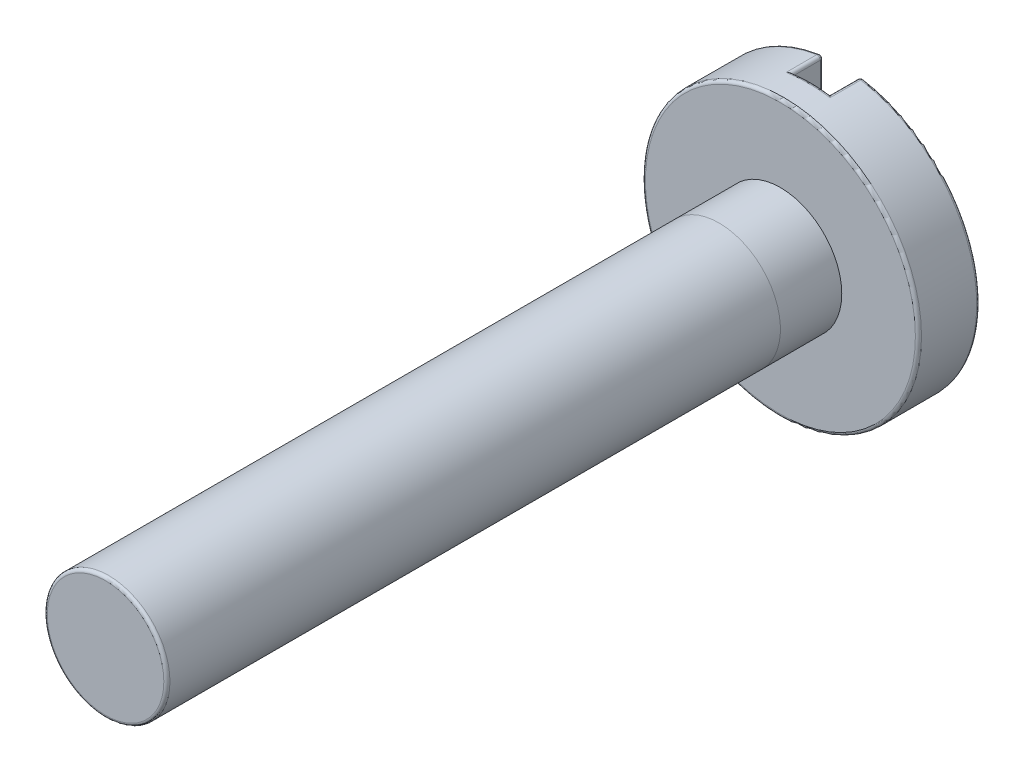
ISO-10303-21;
HEADER;
FILE_DESCRIPTION(('STEP AP214'),'2;1');
FILE_NAME('part.step','',(''),(''),'','','');
FILE_SCHEMA(('AUTOMOTIVE_DESIGN { 1 0 10303 214 1 1 1 1 }'));
ENDSEC;
DATA;
#1=APPLICATION_CONTEXT('core data for automotive mechanical design processes');
#2=APPLICATION_PROTOCOL_DEFINITION('international standard','automotive_design',2000,#1);
#3=PRODUCT_CONTEXT('',#1,'mechanical');
#4=PRODUCT('Part','Part','',(#3));
#5=PRODUCT_RELATED_PRODUCT_CATEGORY('part','',(#4));
#6=PRODUCT_DEFINITION_FORMATION('','',#4);
#7=PRODUCT_DEFINITION_CONTEXT('part definition',#1,'design');
#8=PRODUCT_DEFINITION('design','',#6,#7);
#9=PRODUCT_DEFINITION_SHAPE('','',#8);
#10=(LENGTH_UNIT() NAMED_UNIT(*) SI_UNIT(.MILLI.,.METRE.));
#11=(NAMED_UNIT(*) PLANE_ANGLE_UNIT() SI_UNIT($,.RADIAN.));
#12=(NAMED_UNIT(*) SI_UNIT($,.STERADIAN.) SOLID_ANGLE_UNIT());
#13=UNCERTAINTY_MEASURE_WITH_UNIT(LENGTH_MEASURE(1.E-05),#10,'distance_accuracy_value','');
#14=(GEOMETRIC_REPRESENTATION_CONTEXT(3) GLOBAL_UNCERTAINTY_ASSIGNED_CONTEXT((#13)) GLOBAL_UNIT_ASSIGNED_CONTEXT((#10,
#11,#12)) REPRESENTATION_CONTEXT('',''));
#15=CARTESIAN_POINT('',(0.,0.,0.));
#16=DIRECTION('',(0.,0.,1.));
#17=DIRECTION('',(1.,0.,0.));
#18=AXIS2_PLACEMENT_3D('',#15,#16,#17);
#19=CARTESIAN_POINT('',(0.,0.,11.));
#20=DIRECTION('',(0.,0.,-1.));
#21=DIRECTION('',(-1.,0.,0.));
#22=AXIS2_PLACEMENT_3D('',#19,#20,#21);
#23=CYLINDRICAL_SURFACE('',#22,1.);
#24=CARTESIAN_POINT('',(0.,0.,10.95));
#25=DIRECTION('',(0.,0.,1.));
#26=DIRECTION('',(1.,0.,0.));
#27=AXIS2_PLACEMENT_3D('',#24,#25,#26);
#28=CIRCLE('',#27,1.);
#29=CARTESIAN_POINT('',(1.,0.,10.95));
#30=VERTEX_POINT('',#29);
#31=EDGE_CURVE('E175',#30,#30,#28,.F.);
#32=ORIENTED_EDGE('',*,*,#31,.T.);
#33=EDGE_LOOP('',(#32));
#34=FACE_BOUND('',#33,.T.);
#35=CARTESIAN_POINT('',(0.,0.,0.999999999999999));
#36=DIRECTION('',(0.,0.,-1.));
#37=DIRECTION('',(-1.,0.,0.));
#38=AXIS2_PLACEMENT_3D('',#35,#36,#37);
#39=CIRCLE('',#38,1.);
#40=CARTESIAN_POINT('',(-1.,0.,0.999999999999999));
#41=VERTEX_POINT('',#40);
#42=EDGE_CURVE('E11',#41,#41,#39,.T.);
#43=ORIENTED_EDGE('',*,*,#42,.F.);
#44=EDGE_LOOP('',(#43));
#45=FACE_BOUND('',#44,.T.);
#46=ADVANCED_FACE('F45',(#34,#45),#23,.T.);
#47=CARTESIAN_POINT('',(0.,0.,-1.));
#48=DIRECTION('',(0.,0.,1.));
#49=DIRECTION('',(1.,0.,0.));
#50=AXIS2_PLACEMENT_3D('',#47,#48,#49);
#51=PLANE('',#50);
#52=DIRECTION('',(0.,-1.,0.));
#53=VECTOR('',#52,1.);
#54=CARTESIAN_POINT('',(-0.35,0.,-1.));
#55=LINE('',#54,#53);
#56=CARTESIAN_POINT('',(-0.35,2.17198066289735,-1.));
#57=VERTEX_POINT('',#56);
#58=CARTESIAN_POINT('',(-0.35,-2.17198066289735,-1.));
#59=VERTEX_POINT('',#58);
#60=EDGE_CURVE('E212',#57,#59,#55,.T.);
#61=ORIENTED_EDGE('',*,*,#60,.T.);
#62=CARTESIAN_POINT('',(0.,0.,-1.));
#63=DIRECTION('',(0.,0.,1.));
#64=DIRECTION('',(1.,0.,0.));
#65=AXIS2_PLACEMENT_3D('',#62,#63,#64);
#66=CIRCLE('',#65,2.2);
#67=EDGE_CURVE('E214',#59,#57,#66,.F.);
#68=ORIENTED_EDGE('',*,*,#67,.T.);
#69=EDGE_LOOP('',(#61,#68));
#70=FACE_BOUND('',#69,.T.);
#71=ADVANCED_FACE('F311',(#70),#51,.F.);
#72=ORIENTED_EDGE('',*,*,#42,.T.);
#73=EDGE_LOOP('',(#72));
#74=FACE_BOUND('',#73,.T.);
#75=CARTESIAN_POINT('',(0.,0.,0.));
#76=DIRECTION('',(0.,0.,1.));
#77=DIRECTION('',(1.,0.,0.));
#78=AXIS2_PLACEMENT_3D('',#75,#76,#77);
#79=CIRCLE('',#78,1.);
#80=CARTESIAN_POINT('',(1.,0.,0.));
#81=VERTEX_POINT('',#80);
#82=EDGE_CURVE('E337',#81,#81,#79,.T.);
#83=ORIENTED_EDGE('',*,*,#82,.T.);
#84=EDGE_LOOP('',(#83));
#85=FACE_BOUND('',#84,.T.);
#86=ADVANCED_FACE('F314',(#74,#85),#23,.T.);
#87=CARTESIAN_POINT('',(0.,0.,11.));
#88=DIRECTION('',(0.,0.,1.));
#89=DIRECTION('',(1.,0.,0.));
#90=AXIS2_PLACEMENT_3D('',#87,#88,#89);
#91=PLANE('',#90);
#92=CARTESIAN_POINT('',(0.,0.,11.));
#93=DIRECTION('',(0.,0.,1.));
#94=DIRECTION('',(1.,0.,0.));
#95=AXIS2_PLACEMENT_3D('',#92,#93,#94);
#96=CIRCLE('',#95,0.95);
#97=CARTESIAN_POINT('',(0.95,0.,11.));
#98=VERTEX_POINT('',#97);
#99=EDGE_CURVE('E339',#98,#98,#96,.T.);
#100=ORIENTED_EDGE('',*,*,#99,.T.);
#101=EDGE_LOOP('',(#100));
#102=FACE_BOUND('',#101,.T.);
#103=ADVANCED_FACE('F326',(#102),#91,.T.);
#104=CARTESIAN_POINT('',(0.,0.,-1.));
#105=DIRECTION('',(0.,0.,1.));
#106=DIRECTION('',(1.,0.,0.));
#107=AXIS2_PLACEMENT_3D('',#104,#105,#106);
#108=CYLINDRICAL_SURFACE('',#107,2.25);
#109=CARTESIAN_POINT('',(0.,0.,-0.05));
#110=DIRECTION('',(0.,0.,1.));
#111=DIRECTION('',(1.,0.,0.));
#112=AXIS2_PLACEMENT_3D('',#109,#110,#111);
#113=CIRCLE('',#112,2.25);
#114=CARTESIAN_POINT('',(2.25,0.,-0.05));
#115=VERTEX_POINT('',#114);
#116=EDGE_CURVE('E189',#115,#115,#113,.F.);
#117=ORIENTED_EDGE('',*,*,#116,.T.);
#118=EDGE_LOOP('',(#117));
#119=FACE_BOUND('',#118,.T.);
#120=DIRECTION('',(0.,0.,1.));
#121=VECTOR('',#120,1.);
#122=CARTESIAN_POINT('',(0.357954545454545,-2.22134385978138,-1.));
#123=LINE('',#122,#121);
#124=CARTESIAN_POINT('',(0.357954545454545,-2.22134385978138,-0.45));
#125=VERTEX_POINT('',#124);
#126=CARTESIAN_POINT('',(0.357954545454545,-2.22134385978138,-0.95));
#127=VERTEX_POINT('',#126);
#128=EDGE_CURVE('E185',#125,#127,#123,.F.);
#129=ORIENTED_EDGE('',*,*,#128,.T.);
#130=CARTESIAN_POINT('',(0.,0.,-0.95));
#131=DIRECTION('',(0.,0.,1.));
#132=DIRECTION('',(1.,0.,0.));
#133=AXIS2_PLACEMENT_3D('',#130,#131,#132);
#134=CIRCLE('',#133,2.25);
#135=CARTESIAN_POINT('',(0.357954545454546,2.22134385978138,-0.95));
#136=VERTEX_POINT('',#135);
#137=EDGE_CURVE('E187',#127,#136,#134,.T.);
#138=ORIENTED_EDGE('',*,*,#137,.T.);
#139=DIRECTION('',(0.,0.,1.));
#140=VECTOR('',#139,1.);
#141=CARTESIAN_POINT('',(0.357954545454546,2.22134385978138,-1.));
#142=LINE('',#141,#140);
#143=CARTESIAN_POINT('',(0.357954545454546,2.22134385978138,-0.45));
#144=VERTEX_POINT('',#143);
#145=EDGE_CURVE('E183',#136,#144,#142,.T.);
#146=ORIENTED_EDGE('',*,*,#145,.T.);
#147=CARTESIAN_POINT('',(0.,0.,-0.45));
#148=DIRECTION('',(0.,0.,-1.));
#149=DIRECTION('',(-1.,0.,0.));
#150=AXIS2_PLACEMENT_3D('',#147,#148,#149);
#151=CIRCLE('',#150,2.25);
#152=CARTESIAN_POINT('',(-0.357954545454545,2.22134385978138,-0.45));
#153=VERTEX_POINT('',#152);
#154=EDGE_CURVE('E141',#144,#153,#151,.F.);
#155=ORIENTED_EDGE('',*,*,#154,.T.);
#156=DIRECTION('',(0.,0.,1.));
#157=VECTOR('',#156,1.);
#158=CARTESIAN_POINT('',(-0.357954545454545,2.22134385978138,-1.));
#159=LINE('',#158,#157);
#160=CARTESIAN_POINT('',(-0.357954545454545,2.22134385978138,-0.95));
#161=VERTEX_POINT('',#160);
#162=EDGE_CURVE('E133',#153,#161,#159,.F.);
#163=ORIENTED_EDGE('',*,*,#162,.T.);
#164=CARTESIAN_POINT('',(0.,0.,-0.95));
#165=DIRECTION('',(0.,0.,1.));
#166=DIRECTION('',(1.,0.,0.));
#167=AXIS2_PLACEMENT_3D('',#164,#165,#166);
#168=CIRCLE('',#167,2.25);
#169=CARTESIAN_POINT('',(-0.357954545454546,-2.22134385978138,-0.95));
#170=VERTEX_POINT('',#169);
#171=EDGE_CURVE('E138',#161,#170,#168,.T.);
#172=ORIENTED_EDGE('',*,*,#171,.T.);
#173=DIRECTION('',(0.,0.,1.));
#174=VECTOR('',#173,1.);
#175=CARTESIAN_POINT('',(-0.357954545454546,-2.22134385978138,-1.));
#176=LINE('',#175,#174);
#177=CARTESIAN_POINT('',(-0.357954545454546,-2.22134385978138,-0.45));
#178=VERTEX_POINT('',#177);
#179=EDGE_CURVE('E144',#170,#178,#176,.T.);
#180=ORIENTED_EDGE('',*,*,#179,.T.);
#181=CARTESIAN_POINT('',(0.,0.,-0.45));
#182=DIRECTION('',(0.,0.,-1.));
#183=DIRECTION('',(-1.,0.,0.));
#184=AXIS2_PLACEMENT_3D('',#181,#182,#183);
#185=CIRCLE('',#184,2.25);
#186=EDGE_CURVE('E181',#178,#125,#185,.F.);
#187=ORIENTED_EDGE('',*,*,#186,.T.);
#188=EDGE_LOOP('',(#129,#138,#146,#155,#163,#172,#180,#187));
#189=FACE_BOUND('',#188,.T.);
#190=ADVANCED_FACE('F135',(#119,#189),#108,.T.);
#191=CARTESIAN_POINT('',(0.,0.,-1.));
#192=DIRECTION('',(0.,0.,1.));
#193=DIRECTION('',(1.,0.,0.));
#194=AXIS2_PLACEMENT_3D('',#191,#192,#193);
#195=CIRCLE('',#194,2.2);
#196=CARTESIAN_POINT('',(0.35,2.17198066289735,-1.));
#197=VERTEX_POINT('',#196);
#198=CARTESIAN_POINT('',(0.35,-2.17198066289735,-1.));
#199=VERTEX_POINT('',#198);
#200=EDGE_CURVE('E207',#197,#199,#195,.F.);
#201=ORIENTED_EDGE('',*,*,#200,.T.);
#202=DIRECTION('',(0.,1.,0.));
#203=VECTOR('',#202,1.);
#204=CARTESIAN_POINT('',(0.35,0.,-1.));
#205=LINE('',#204,#203);
#206=EDGE_CURVE('E209',#199,#197,#205,.T.);
#207=ORIENTED_EDGE('',*,*,#206,.T.);
#208=EDGE_LOOP('',(#201,#207));
#209=FACE_BOUND('',#208,.T.);
#210=ADVANCED_FACE('F320',(#209),#51,.F.);
#211=CARTESIAN_POINT('',(0.,0.,0.));
#212=DIRECTION('',(0.,0.,1.));
#213=DIRECTION('',(1.,0.,0.));
#214=AXIS2_PLACEMENT_3D('',#211,#212,#213);
#215=PLANE('',#214);
#216=CARTESIAN_POINT('',(0.,0.,0.));
#217=DIRECTION('',(0.,0.,1.));
#218=DIRECTION('',(1.,0.,0.));
#219=AXIS2_PLACEMENT_3D('',#216,#217,#218);
#220=CIRCLE('',#219,2.2);
#221=CARTESIAN_POINT('',(2.2,0.,0.));
#222=VERTEX_POINT('',#221);
#223=EDGE_CURVE('E172',#222,#222,#220,.T.);
#224=ORIENTED_EDGE('',*,*,#223,.T.);
#225=EDGE_LOOP('',(#224));
#226=FACE_BOUND('',#225,.T.);
#227=ORIENTED_EDGE('',*,*,#82,.F.);
#228=EDGE_LOOP('',(#227));
#229=FACE_BOUND('',#228,.T.);
#230=ADVANCED_FACE('F370',(#226,#229),#215,.T.);
#231=CARTESIAN_POINT('',(-0.299999999999999,4.18375597630475,-0.5));
#232=DIRECTION('',(-1.,0.,0.));
#233=DIRECTION('',(0.,-1.,0.));
#234=AXIS2_PLACEMENT_3D('',#231,#232,#233);
#235=PLANE('',#234);
#236=DIRECTION('',(0.,1.,0.));
#237=VECTOR('',#236,1.);
#238=CARTESIAN_POINT('',(-0.299999999999999,4.18375597630475,-0.5));
#239=LINE('',#238,#237);
#240=CARTESIAN_POINT('',(-0.3,-2.17198066289735,-0.5));
#241=VERTEX_POINT('',#240);
#242=CARTESIAN_POINT('',(-0.3,2.17198066289735,-0.5));
#243=VERTEX_POINT('',#242);
#244=EDGE_CURVE('E345',#241,#243,#239,.T.);
#245=ORIENTED_EDGE('',*,*,#244,.F.);
#246=DIRECTION('',(0.,0.,-1.));
#247=VECTOR('',#246,1.);
#248=CARTESIAN_POINT('',(-0.3,-2.17198066289735,-1.));
#249=LINE('',#248,#247);
#250=CARTESIAN_POINT('',(-0.3,-2.17198066289735,-0.95));
#251=VERTEX_POINT('',#250);
#252=EDGE_CURVE('E195',#241,#251,#249,.T.);
#253=ORIENTED_EDGE('',*,*,#252,.T.);
#254=DIRECTION('',(0.,-1.,0.));
#255=VECTOR('',#254,1.);
#256=CARTESIAN_POINT('',(-0.299999999999999,4.18375597630475,-0.95));
#257=LINE('',#256,#255);
#258=CARTESIAN_POINT('',(-0.3,2.17198066289735,-0.95));
#259=VERTEX_POINT('',#258);
#260=EDGE_CURVE('E192',#251,#259,#257,.F.);
#261=ORIENTED_EDGE('',*,*,#260,.T.);
#262=DIRECTION('',(0.,0.,-1.));
#263=VECTOR('',#262,1.);
#264=CARTESIAN_POINT('',(-0.3,2.17198066289735,-0.5));
#265=LINE('',#264,#263);
#266=EDGE_CURVE('E152',#259,#243,#265,.F.);
#267=ORIENTED_EDGE('',*,*,#266,.T.);
#268=EDGE_LOOP('',(#245,#253,#261,#267));
#269=FACE_BOUND('',#268,.T.);
#270=ADVANCED_FACE('F365',(#269),#235,.F.);
#271=CARTESIAN_POINT('',(0.3,4.18375597630475,-0.5));
#272=DIRECTION('',(1.,0.,0.));
#273=DIRECTION('',(0.,1.,0.));
#274=AXIS2_PLACEMENT_3D('',#271,#272,#273);
#275=PLANE('',#274);
#276=DIRECTION('',(0.,1.,0.));
#277=VECTOR('',#276,1.);
#278=CARTESIAN_POINT('',(0.3,4.18375597630475,-0.95));
#279=LINE('',#278,#277);
#280=CARTESIAN_POINT('',(0.3,2.17198066289735,-0.95));
#281=VERTEX_POINT('',#280);
#282=CARTESIAN_POINT('',(0.3,-2.17198066289735,-0.95));
#283=VERTEX_POINT('',#282);
#284=EDGE_CURVE('E201',#281,#283,#279,.F.);
#285=ORIENTED_EDGE('',*,*,#284,.T.);
#286=DIRECTION('',(0.,0.,-1.));
#287=VECTOR('',#286,1.);
#288=CARTESIAN_POINT('',(0.3,-2.17198066289735,-0.5));
#289=LINE('',#288,#287);
#290=CARTESIAN_POINT('',(0.3,-2.17198066289735,-0.5));
#291=VERTEX_POINT('',#290);
#292=EDGE_CURVE('E205',#283,#291,#289,.F.);
#293=ORIENTED_EDGE('',*,*,#292,.T.);
#294=DIRECTION('',(0.,-1.,0.));
#295=VECTOR('',#294,1.);
#296=CARTESIAN_POINT('',(0.3,4.18375597630475,-0.5));
#297=LINE('',#296,#295);
#298=CARTESIAN_POINT('',(0.3,2.17198066289735,-0.5));
#299=VERTEX_POINT('',#298);
#300=EDGE_CURVE('E340',#299,#291,#297,.T.);
#301=ORIENTED_EDGE('',*,*,#300,.F.);
#302=DIRECTION('',(0.,0.,-1.));
#303=VECTOR('',#302,1.);
#304=CARTESIAN_POINT('',(0.3,2.17198066289735,-1.));
#305=LINE('',#304,#303);
#306=EDGE_CURVE('E203',#299,#281,#305,.T.);
#307=ORIENTED_EDGE('',*,*,#306,.T.);
#308=EDGE_LOOP('',(#285,#293,#301,#307));
#309=FACE_BOUND('',#308,.T.);
#310=ADVANCED_FACE('F360',(#309),#275,.F.);
#311=CARTESIAN_POINT('',(0.,0.,-0.5));
#312=DIRECTION('',(0.,0.,-1.));
#313=DIRECTION('',(-1.,0.,0.));
#314=AXIS2_PLACEMENT_3D('',#311,#312,#313);
#315=PLANE('',#314);
#316=ORIENTED_EDGE('',*,*,#300,.T.);
#317=CARTESIAN_POINT('',(0.35,-2.17198066289735,-0.5));
#318=DIRECTION('',(0.,0.,-1.));
#319=DIRECTION('',(-1.,0.,0.));
#320=AXIS2_PLACEMENT_3D('',#317,#318,#319);
#321=CIRCLE('',#320,0.05);
#322=CARTESIAN_POINT('',(0.300549597846717,-2.17937374932208,-0.5));
#323=VERTEX_POINT('',#322);
#324=EDGE_CURVE('E218',#291,#323,#321,.F.);
#325=ORIENTED_EDGE('',*,*,#324,.T.);
#326=CARTESIAN_POINT('',(0.,0.,-0.5));
#327=DIRECTION('',(0.,0.,-1.));
#328=DIRECTION('',(-1.,0.,0.));
#329=AXIS2_PLACEMENT_3D('',#326,#327,#328);
#330=CIRCLE('',#329,2.2);
#331=CARTESIAN_POINT('',(-0.300549597846718,-2.17937374932208,-0.5));
#332=VERTEX_POINT('',#331);
#333=EDGE_CURVE('E199',#323,#332,#330,.T.);
#334=ORIENTED_EDGE('',*,*,#333,.T.);
#335=CARTESIAN_POINT('',(-0.35,-2.17198066289735,-0.5));
#336=DIRECTION('',(0.,0.,-1.));
#337=DIRECTION('',(-1.,0.,0.));
#338=AXIS2_PLACEMENT_3D('',#335,#336,#337);
#339=CIRCLE('',#338,0.05);
#340=EDGE_CURVE('E216',#332,#241,#339,.F.);
#341=ORIENTED_EDGE('',*,*,#340,.T.);
#342=ORIENTED_EDGE('',*,*,#244,.T.);
#343=CARTESIAN_POINT('',(-0.35,2.17198066289735,-0.5));
#344=DIRECTION('',(0.,0.,-1.));
#345=DIRECTION('',(-1.,0.,0.));
#346=AXIS2_PLACEMENT_3D('',#343,#344,#345);
#347=CIRCLE('',#346,0.05);
#348=CARTESIAN_POINT('',(-0.300549597846718,2.17937374932208,-0.5));
#349=VERTEX_POINT('',#348);
#350=EDGE_CURVE('E221',#243,#349,#347,.F.);
#351=ORIENTED_EDGE('',*,*,#350,.T.);
#352=CARTESIAN_POINT('',(0.,0.,-0.5));
#353=DIRECTION('',(0.,0.,-1.));
#354=DIRECTION('',(-1.,0.,0.));
#355=AXIS2_PLACEMENT_3D('',#352,#353,#354);
#356=CIRCLE('',#355,2.2);
#357=CARTESIAN_POINT('',(0.300549597846718,2.17937374932208,-0.5));
#358=VERTEX_POINT('',#357);
#359=EDGE_CURVE('E61',#349,#358,#356,.T.);
#360=ORIENTED_EDGE('',*,*,#359,.T.);
#361=CARTESIAN_POINT('',(0.35,2.17198066289735,-0.5));
#362=DIRECTION('',(0.,0.,-1.));
#363=DIRECTION('',(-1.,0.,0.));
#364=AXIS2_PLACEMENT_3D('',#361,#362,#363);
#365=CIRCLE('',#364,0.05);
#366=EDGE_CURVE('E54',#358,#299,#365,.F.);
#367=ORIENTED_EDGE('',*,*,#366,.T.);
#368=EDGE_LOOP('',(#316,#325,#334,#341,#342,#351,#360,#367));
#369=FACE_BOUND('',#368,.T.);
#370=ADVANCED_FACE('F353',(#369),#315,.T.);
#371=CARTESIAN_POINT('',(0.,0.,10.95));
#372=DIRECTION('',(0.,0.,1.));
#373=DIRECTION('',(1.,0.,0.));
#374=AXIS2_PLACEMENT_3D('',#371,#372,#373);
#375=TOROIDAL_SURFACE('',#374,0.95,0.05);
#376=ORIENTED_EDGE('',*,*,#31,.F.);
#377=EDGE_LOOP('',(#376));
#378=FACE_BOUND('',#377,.T.);
#379=ORIENTED_EDGE('',*,*,#99,.F.);
#380=EDGE_LOOP('',(#379));
#381=FACE_BOUND('',#380,.T.);
#382=ADVANCED_FACE('F350',(#378,#381),#375,.T.);
#383=CARTESIAN_POINT('',(0.,0.,-0.05));
#384=DIRECTION('',(0.,0.,1.));
#385=DIRECTION('',(1.,0.,0.));
#386=AXIS2_PLACEMENT_3D('',#383,#384,#385);
#387=TOROIDAL_SURFACE('',#386,2.2,0.05);
#388=ORIENTED_EDGE('',*,*,#116,.F.);
#389=EDGE_LOOP('',(#388));
#390=FACE_BOUND('',#389,.T.);
#391=ORIENTED_EDGE('',*,*,#223,.F.);
#392=EDGE_LOOP('',(#391));
#393=FACE_BOUND('',#392,.T.);
#394=ADVANCED_FACE('F301',(#390,#393),#387,.T.);
#395=CARTESIAN_POINT('',(0.35,2.17198066289735,-1.));
#396=DIRECTION('',(0.,0.,1.));
#397=DIRECTION('',(1.,0.,0.));
#398=AXIS2_PLACEMENT_3D('',#395,#396,#397);
#399=CYLINDRICAL_SURFACE('',#398,0.05);
#400=CARTESIAN_POINT('',(0.35,2.17198066289735,-0.95));
#401=DIRECTION('',(0.,0.,-1.));
#402=DIRECTION('',(-1.,0.,0.));
#403=AXIS2_PLACEMENT_3D('',#400,#401,#402);
#404=CIRCLE('',#403,0.05);
#405=EDGE_CURVE('E296',#281,#136,#404,.T.);
#406=ORIENTED_EDGE('',*,*,#405,.F.);
#407=ORIENTED_EDGE('',*,*,#306,.F.);
#408=ORIENTED_EDGE('',*,*,#366,.F.);
#409=CARTESIAN_POINT('',(0.300549597846718,2.17937374932208,-0.5));
#410=CARTESIAN_POINT('',(0.300878630902095,2.18160008974712,-0.500003714930084));
#411=CARTESIAN_POINT('',(0.301364269610089,2.18379707083228,-0.499848331920984));
#412=CARTESIAN_POINT('',(0.302603544912947,2.18805370757264,-0.499253534206389));
#413=CARTESIAN_POINT('',(0.303354810864081,2.19011439249536,-0.498816604727432));
#414=CARTESIAN_POINT('',(0.305084801713858,2.19405508271378,-0.497693422200345));
#415=CARTESIAN_POINT('',(0.306062876183291,2.19593558334217,-0.497007879001798));
#416=CARTESIAN_POINT('',(0.308201736558632,2.19949848671673,-0.49542964406847));
#417=CARTESIAN_POINT('',(0.309362935674541,2.20118042603846,-0.494536481638797));
#418=CARTESIAN_POINT('',(0.312326231473174,2.20497478196462,-0.492186247676904));
#419=CARTESIAN_POINT('',(0.314196665006164,2.20698330755862,-0.490647700825454));
#420=CARTESIAN_POINT('',(0.318117423660753,2.21058927757545,-0.487337313323222));
#421=CARTESIAN_POINT('',(0.320168082704398,2.21218593640642,-0.485565036442284));
#422=CARTESIAN_POINT('',(0.325174356627317,2.21552179180571,-0.481159110482362));
#423=CARTESIAN_POINT('',(0.328180139662042,2.21708855242774,-0.478452277001111));
#424=CARTESIAN_POINT('',(0.334285332308091,2.21956127988859,-0.472852954038686));
#425=CARTESIAN_POINT('',(0.337384839930087,2.22046652819379,-0.469960266380947));
#426=CARTESIAN_POINT('',(0.343252158949838,2.2216029021788,-0.464399739788997));
#427=CARTESIAN_POINT('',(0.346018443758925,2.2218979078447,-0.461742765791068));
#428=CARTESIAN_POINT('',(0.351517832179379,2.22203306388318,-0.45639233642635));
#429=CARTESIAN_POINT('',(0.354250989727151,2.22187409508117,-0.453698961783337));
#430=CARTESIAN_POINT('',(0.357284666522413,2.22144831072264,-0.450670388259769));
#431=CARTESIAN_POINT('',(0.357619899702365,2.22139778021012,-0.450335173985902));
#432=CARTESIAN_POINT('',(0.357954545454546,2.22134385978138,-0.45));
#433=B_SPLINE_CURVE_WITH_KNOTS('',3,(#409,#410,#411,#412,#413,#414,#415,#416,#417,#418,#419,
#420,#421,#422,#423,#424,#425,#426,#427,#428,#429,#430,#431,#432),.UNSPECIFIED.,.F.,.F.,(4,2,2,
2,2,2,2,2,2,2,2,4),(0.,0.00673155901227517,0.0134044973561963,0.0200585310229242,
0.0267277998108987,0.0361148946880161,0.0455197642176528,0.0584635379232842,0.0714213503213394,
0.0829352010264816,0.0944267271328636,0.0958569584358021),.UNSPECIFIED.);
#434=EDGE_CURVE('E291',#144,#358,#433,.F.);
#435=ORIENTED_EDGE('',*,*,#434,.F.);
#436=ORIENTED_EDGE('',*,*,#145,.F.);
#437=EDGE_LOOP('',(#406,#407,#408,#435,#436));
#438=FACE_BOUND('',#437,.T.);
#439=ADVANCED_FACE('F298',(#438),#399,.T.);
#440=CARTESIAN_POINT('',(0.35,2.17198066289735,-0.95));
#441=DIRECTION('',(0.,0.,-1.));
#442=DIRECTION('',(-1.,0.,0.));
#443=AXIS2_PLACEMENT_3D('',#440,#441,#442);
#444=SPHERICAL_SURFACE('',#443,0.05);
#445=CARTESIAN_POINT('',(0.35,2.17198066289735,-0.95));
#446=DIRECTION('',(0.,1.,0.));
#447=DIRECTION('',(0.,0.,1.));
#448=AXIS2_PLACEMENT_3D('',#445,#446,#447);
#449=CIRCLE('',#448,0.05);
#450=EDGE_CURVE('E278',#281,#197,#449,.F.);
#451=ORIENTED_EDGE('',*,*,#450,.F.);
#452=ORIENTED_EDGE('',*,*,#405,.T.);
#453=CARTESIAN_POINT('',(0.35,2.17198066289735,-0.95));
#454=DIRECTION('',(-0.987263937680612,0.15909090909091,0.));
#455=DIRECTION('',(-0.15909090909091,-0.987263937680612,0.));
#456=AXIS2_PLACEMENT_3D('',#453,#454,#455);
#457=CIRCLE('',#456,0.05);
#458=EDGE_CURVE('E297',#197,#136,#457,.F.);
#459=ORIENTED_EDGE('',*,*,#458,.F.);
#460=EDGE_LOOP('',(#451,#452,#459));
#461=FACE_BOUND('',#460,.T.);
#462=ADVANCED_FACE('F47',(#461),#444,.T.);
#463=CARTESIAN_POINT('',(0.,0.,-0.45));
#464=DIRECTION('',(0.,0.,-1.));
#465=DIRECTION('',(-1.,0.,0.));
#466=AXIS2_PLACEMENT_3D('',#463,#464,#465);
#467=TOROIDAL_SURFACE('',#466,2.2,0.05);
#468=ORIENTED_EDGE('',*,*,#359,.F.);
#469=CARTESIAN_POINT('',(-0.300549597846718,2.17937374932208,-0.5));
#470=CARTESIAN_POINT('',(-0.300878630902095,2.18160008974712,-0.500003714930084));
#471=CARTESIAN_POINT('',(-0.301364269610088,2.18379707083228,-0.499848331920984));
#472=CARTESIAN_POINT('',(-0.302603544912946,2.18805370757264,-0.499253534206389));
#473=CARTESIAN_POINT('',(-0.303354810864081,2.19011439249536,-0.498816604727432));
#474=CARTESIAN_POINT('',(-0.305084801713857,2.19405508271378,-0.497693422200345));
#475=CARTESIAN_POINT('',(-0.306062876183291,2.19593558334217,-0.497007879001798));
#476=CARTESIAN_POINT('',(-0.308201736558631,2.19949848671673,-0.49542964406847));
#477=CARTESIAN_POINT('',(-0.309362935674541,2.20118042603846,-0.494536481638797));
#478=CARTESIAN_POINT('',(-0.312326231473173,2.20497478196462,-0.492186247676904));
#479=CARTESIAN_POINT('',(-0.314196665006164,2.20698330755862,-0.490647700825455));
#480=CARTESIAN_POINT('',(-0.318117423660753,2.21058927757545,-0.487337313323223));
#481=CARTESIAN_POINT('',(-0.320168082704398,2.21218593640642,-0.485565036442284));
#482=CARTESIAN_POINT('',(-0.325174356627317,2.21552179180571,-0.481159110482362));
#483=CARTESIAN_POINT('',(-0.328180139662042,2.21708855242774,-0.478452277001111));
#484=CARTESIAN_POINT('',(-0.33428533230809,2.21956127988859,-0.472852954038686));
#485=CARTESIAN_POINT('',(-0.337384839930086,2.22046652819379,-0.469960266380947));
#486=CARTESIAN_POINT('',(-0.343252158949838,2.2216029021788,-0.464399739788997));
#487=CARTESIAN_POINT('',(-0.346018443758925,2.2218979078447,-0.461742765791069));
#488=CARTESIAN_POINT('',(-0.351517832179378,2.22203306388318,-0.45639233642635));
#489=CARTESIAN_POINT('',(-0.354250989727149,2.22187409508117,-0.453698961783336));
#490=CARTESIAN_POINT('',(-0.357284666522412,2.22144831072264,-0.450670388259768));
#491=CARTESIAN_POINT('',(-0.357619899702364,2.22139778021012,-0.450335173985902));
#492=CARTESIAN_POINT('',(-0.357954545454545,2.22134385978138,-0.45));
#493=B_SPLINE_CURVE_WITH_KNOTS('',3,(#469,#470,#471,#472,#473,#474,#475,#476,#477,#478,#479,
#480,#481,#482,#483,#484,#485,#486,#487,#488,#489,#490,#491,#492),.UNSPECIFIED.,.F.,.F.,(4,2,2,
2,2,2,2,2,2,2,2,4),(0.,0.00673155901227517,0.0134044973561963,0.0200585310229242,
0.0267277998108987,0.0361148946880164,0.0455197642176528,0.0584635379232842,0.0714213503213394,
0.0829352010264816,0.0944267271328637,0.0958569584358021),.UNSPECIFIED.);
#494=EDGE_CURVE('E270',#153,#349,#493,.F.);
#495=ORIENTED_EDGE('',*,*,#494,.F.);
#496=ORIENTED_EDGE('',*,*,#154,.F.);
#497=ORIENTED_EDGE('',*,*,#434,.T.);
#498=EDGE_LOOP('',(#468,#495,#496,#497));
#499=FACE_BOUND('',#498,.T.);
#500=ADVANCED_FACE('F282',(#499),#467,.T.);
#501=CARTESIAN_POINT('',(0.,0.,-0.95));
#502=DIRECTION('',(0.,0.,1.));
#503=DIRECTION('',(1.,0.,0.));
#504=AXIS2_PLACEMENT_3D('',#501,#502,#503);
#505=TOROIDAL_SURFACE('',#504,2.2,0.05);
#506=ORIENTED_EDGE('',*,*,#458,.T.);
#507=ORIENTED_EDGE('',*,*,#137,.F.);
#508=CARTESIAN_POINT('',(0.35,-2.17198066289735,-0.95));
#509=DIRECTION('',(-0.987263937680612,-0.159090909090908,0.));
#510=DIRECTION('',(0.159090909090908,-0.987263937680612,0.));
#511=AXIS2_PLACEMENT_3D('',#508,#509,#510);
#512=CIRCLE('',#511,0.05);
#513=EDGE_CURVE('E267',#199,#127,#512,.T.);
#514=ORIENTED_EDGE('',*,*,#513,.F.);
#515=ORIENTED_EDGE('',*,*,#200,.F.);
#516=EDGE_LOOP('',(#506,#507,#514,#515));
#517=FACE_BOUND('',#516,.T.);
#518=ADVANCED_FACE('F286',(#517),#505,.T.);
#519=CARTESIAN_POINT('',(0.35,0.,-0.95));
#520=DIRECTION('',(0.,1.,0.));
#521=DIRECTION('',(-1.,0.,0.));
#522=AXIS2_PLACEMENT_3D('',#519,#520,#521);
#523=CYLINDRICAL_SURFACE('',#522,0.05);
#524=ORIENTED_EDGE('',*,*,#450,.T.);
#525=ORIENTED_EDGE('',*,*,#206,.F.);
#526=CARTESIAN_POINT('',(0.35,-2.17198066289735,-0.95));
#527=DIRECTION('',(0.,-1.,0.));
#528=DIRECTION('',(0.,0.,-1.));
#529=AXIS2_PLACEMENT_3D('',#526,#527,#528);
#530=CIRCLE('',#529,0.05);
#531=EDGE_CURVE('E156',#283,#199,#530,.T.);
#532=ORIENTED_EDGE('',*,*,#531,.F.);
#533=ORIENTED_EDGE('',*,*,#284,.F.);
#534=EDGE_LOOP('',(#524,#525,#532,#533));
#535=FACE_BOUND('',#534,.T.);
#536=ADVANCED_FACE('F287',(#535),#523,.T.);
#537=CARTESIAN_POINT('',(-0.35,2.17198066289735,-1.));
#538=DIRECTION('',(0.,0.,1.));
#539=DIRECTION('',(1.,0.,0.));
#540=AXIS2_PLACEMENT_3D('',#537,#538,#539);
#541=CYLINDRICAL_SURFACE('',#540,0.05);
#542=ORIENTED_EDGE('',*,*,#350,.F.);
#543=ORIENTED_EDGE('',*,*,#266,.F.);
#544=CARTESIAN_POINT('',(-0.35,2.17198066289735,-0.95));
#545=DIRECTION('',(0.,0.,-1.));
#546=DIRECTION('',(-1.,0.,0.));
#547=AXIS2_PLACEMENT_3D('',#544,#545,#546);
#548=CIRCLE('',#547,0.05);
#549=EDGE_CURVE('E148',#161,#259,#548,.T.);
#550=ORIENTED_EDGE('',*,*,#549,.F.);
#551=ORIENTED_EDGE('',*,*,#162,.F.);
#552=ORIENTED_EDGE('',*,*,#494,.T.);
#553=EDGE_LOOP('',(#542,#543,#550,#551,#552));
#554=FACE_BOUND('',#553,.T.);
#555=ADVANCED_FACE('F151',(#554),#541,.T.);
#556=CARTESIAN_POINT('',(0.35,-2.17198066289735,-0.95));
#557=DIRECTION('',(0.,0.,-1.));
#558=DIRECTION('',(-1.,0.,0.));
#559=AXIS2_PLACEMENT_3D('',#556,#557,#558);
#560=SPHERICAL_SURFACE('',#559,0.05);
#561=ORIENTED_EDGE('',*,*,#531,.T.);
#562=ORIENTED_EDGE('',*,*,#513,.T.);
#563=CARTESIAN_POINT('',(0.35,-2.17198066289735,-0.95));
#564=DIRECTION('',(0.,0.,-1.));
#565=DIRECTION('',(-1.,0.,0.));
#566=AXIS2_PLACEMENT_3D('',#563,#564,#565);
#567=CIRCLE('',#566,0.05);
#568=EDGE_CURVE('E157',#283,#127,#567,.F.);
#569=ORIENTED_EDGE('',*,*,#568,.F.);
#570=EDGE_LOOP('',(#561,#562,#569));
#571=FACE_BOUND('',#570,.T.);
#572=ADVANCED_FACE('F439',(#571),#560,.T.);
#573=CARTESIAN_POINT('',(-0.35,2.17198066289735,-0.95));
#574=DIRECTION('',(0.,0.,-1.));
#575=DIRECTION('',(-1.,0.,0.));
#576=AXIS2_PLACEMENT_3D('',#573,#574,#575);
#577=SPHERICAL_SURFACE('',#576,0.05);
#578=CARTESIAN_POINT('',(-0.35,2.17198066289735,-0.95));
#579=DIRECTION('',(0.987263937680613,0.159090909090907,0.));
#580=DIRECTION('',(-0.159090909090907,0.987263937680613,0.));
#581=AXIS2_PLACEMENT_3D('',#578,#579,#580);
#582=CIRCLE('',#581,0.05);
#583=EDGE_CURVE('E160',#161,#57,#582,.F.);
#584=ORIENTED_EDGE('',*,*,#583,.F.);
#585=ORIENTED_EDGE('',*,*,#549,.T.);
#586=CARTESIAN_POINT('',(-0.35,2.17198066289735,-0.95));
#587=DIRECTION('',(0.,1.,0.));
#588=DIRECTION('',(0.,0.,1.));
#589=AXIS2_PLACEMENT_3D('',#586,#587,#588);
#590=CIRCLE('',#589,0.05);
#591=EDGE_CURVE('E162',#57,#259,#590,.F.);
#592=ORIENTED_EDGE('',*,*,#591,.F.);
#593=EDGE_LOOP('',(#584,#585,#592));
#594=FACE_BOUND('',#593,.T.);
#595=ADVANCED_FACE('F161',(#594),#577,.T.);
#596=CARTESIAN_POINT('',(0.35,-2.17198066289735,-1.));
#597=DIRECTION('',(0.,0.,1.));
#598=DIRECTION('',(1.,0.,0.));
#599=AXIS2_PLACEMENT_3D('',#596,#597,#598);
#600=CYLINDRICAL_SURFACE('',#599,0.05);
#601=ORIENTED_EDGE('',*,*,#568,.T.);
#602=ORIENTED_EDGE('',*,*,#128,.F.);
#603=CARTESIAN_POINT('',(0.300549597846717,-2.17937374932208,-0.5));
#604=CARTESIAN_POINT('',(0.300878630902095,-2.18160008974712,-0.500003714930084));
#605=CARTESIAN_POINT('',(0.301364269610088,-2.18379707083228,-0.499848331920984));
#606=CARTESIAN_POINT('',(0.302603544912946,-2.18805370757264,-0.499253534206389));
#607=CARTESIAN_POINT('',(0.303354810864081,-2.19011439249536,-0.498816604727432));
#608=CARTESIAN_POINT('',(0.305084801713857,-2.19405508271378,-0.497693422200345));
#609=CARTESIAN_POINT('',(0.306062876183291,-2.19593558334217,-0.497007879001798));
#610=CARTESIAN_POINT('',(0.308201736558631,-2.19949848671673,-0.49542964406847));
#611=CARTESIAN_POINT('',(0.309362935674541,-2.20118042603846,-0.494536481638797));
#612=CARTESIAN_POINT('',(0.312326231473173,-2.20497478196462,-0.492186247676904));
#613=CARTESIAN_POINT('',(0.314196665006164,-2.20698330755862,-0.490647700825455));
#614=CARTESIAN_POINT('',(0.318117423660753,-2.21058927757545,-0.487337313323223));
#615=CARTESIAN_POINT('',(0.320168082704398,-2.21218593640642,-0.485565036442284));
#616=CARTESIAN_POINT('',(0.325174356627317,-2.21552179180571,-0.481159110482362));
#617=CARTESIAN_POINT('',(0.328180139662042,-2.21708855242774,-0.478452277001111));
#618=CARTESIAN_POINT('',(0.33428533230809,-2.21956127988859,-0.472852954038686));
#619=CARTESIAN_POINT('',(0.337384839930086,-2.22046652819379,-0.469960266380948));
#620=CARTESIAN_POINT('',(0.343252158949838,-2.2216029021788,-0.464399739788997));
#621=CARTESIAN_POINT('',(0.346018443758924,-2.2218979078447,-0.461742765791068));
#622=CARTESIAN_POINT('',(0.351517832179378,-2.22203306388318,-0.45639233642635));
#623=CARTESIAN_POINT('',(0.354250989727151,-2.22187409508117,-0.453698961783338));
#624=CARTESIAN_POINT('',(0.357284666522412,-2.22144831072264,-0.450670388259769));
#625=CARTESIAN_POINT('',(0.357619899702364,-2.22139778021012,-0.450335173985902));
#626=CARTESIAN_POINT('',(0.357954545454545,-2.22134385978138,-0.45));
#627=B_SPLINE_CURVE_WITH_KNOTS('',3,(#603,#604,#605,#606,#607,#608,#609,#610,#611,#612,#613,
#614,#615,#616,#617,#618,#619,#620,#621,#622,#623,#624,#625,#626),.UNSPECIFIED.,.F.,.F.,(4,2,2,
2,2,2,2,2,2,2,2,4),(0.,0.00673155901227517,0.0134044973561963,0.0200585310229242,
0.0267277998108987,0.0361148946880164,0.0455197642176528,0.0584635379232842,0.0714213503213394,
0.0829352010264816,0.0944267271328637,0.0958569584358021),.UNSPECIFIED.);
#628=EDGE_CURVE('E166',#323,#125,#627,.T.);
#629=ORIENTED_EDGE('',*,*,#628,.F.);
#630=ORIENTED_EDGE('',*,*,#324,.F.);
#631=ORIENTED_EDGE('',*,*,#292,.F.);
#632=EDGE_LOOP('',(#601,#602,#629,#630,#631));
#633=FACE_BOUND('',#632,.T.);
#634=ADVANCED_FACE('F247',(#633),#600,.T.);
#635=CARTESIAN_POINT('',(-0.35,0.,-0.95));
#636=DIRECTION('',(0.,-1.,0.));
#637=DIRECTION('',(1.,0.,0.));
#638=AXIS2_PLACEMENT_3D('',#635,#636,#637);
#639=CYLINDRICAL_SURFACE('',#638,0.05);
#640=ORIENTED_EDGE('',*,*,#591,.T.);
#641=ORIENTED_EDGE('',*,*,#260,.F.);
#642=CARTESIAN_POINT('',(-0.35,-2.17198066289735,-0.95));
#643=DIRECTION('',(0.,-1.,0.));
#644=DIRECTION('',(0.,0.,-1.));
#645=AXIS2_PLACEMENT_3D('',#642,#643,#644);
#646=CIRCLE('',#645,0.05);
#647=EDGE_CURVE('E260',#59,#251,#646,.T.);
#648=ORIENTED_EDGE('',*,*,#647,.F.);
#649=ORIENTED_EDGE('',*,*,#60,.F.);
#650=EDGE_LOOP('',(#640,#641,#648,#649));
#651=FACE_BOUND('',#650,.T.);
#652=ADVANCED_FACE('F251',(#651),#639,.T.);
#653=CARTESIAN_POINT('',(0.,0.,-0.95));
#654=DIRECTION('',(0.,0.,1.));
#655=DIRECTION('',(1.,0.,0.));
#656=AXIS2_PLACEMENT_3D('',#653,#654,#655);
#657=TOROIDAL_SURFACE('',#656,2.2,0.05);
#658=ORIENTED_EDGE('',*,*,#583,.T.);
#659=ORIENTED_EDGE('',*,*,#67,.F.);
#660=CARTESIAN_POINT('',(-0.35,-2.17198066289735,-0.95));
#661=DIRECTION('',(0.987263937680612,-0.15909090909091,0.));
#662=DIRECTION('',(0.15909090909091,0.987263937680612,0.));
#663=AXIS2_PLACEMENT_3D('',#660,#661,#662);
#664=CIRCLE('',#663,0.05);
#665=EDGE_CURVE('E170',#170,#59,#664,.T.);
#666=ORIENTED_EDGE('',*,*,#665,.F.);
#667=ORIENTED_EDGE('',*,*,#171,.F.);
#668=EDGE_LOOP('',(#658,#659,#666,#667));
#669=FACE_BOUND('',#668,.T.);
#670=ADVANCED_FACE('F168',(#669),#657,.T.);
#671=CARTESIAN_POINT('',(0.,0.,-0.45));
#672=DIRECTION('',(0.,0.,-1.));
#673=DIRECTION('',(-1.,0.,0.));
#674=AXIS2_PLACEMENT_3D('',#671,#672,#673);
#675=TOROIDAL_SURFACE('',#674,2.2,0.05);
#676=ORIENTED_EDGE('',*,*,#628,.T.);
#677=ORIENTED_EDGE('',*,*,#186,.F.);
#678=CARTESIAN_POINT('',(-0.300549597846718,-2.17937374932208,-0.5));
#679=CARTESIAN_POINT('',(-0.300878630902095,-2.18160008974712,-0.500003714930084));
#680=CARTESIAN_POINT('',(-0.301364269610089,-2.18379707083228,-0.499848331920984));
#681=CARTESIAN_POINT('',(-0.302603544912947,-2.18805370757264,-0.499253534206389));
#682=CARTESIAN_POINT('',(-0.303354810864081,-2.19011439249536,-0.498816604727432));
#683=CARTESIAN_POINT('',(-0.305084801713858,-2.19405508271378,-0.497693422200345));
#684=CARTESIAN_POINT('',(-0.306062876183291,-2.19593558334217,-0.497007879001799));
#685=CARTESIAN_POINT('',(-0.308201736558632,-2.19949848671672,-0.49542964406847));
#686=CARTESIAN_POINT('',(-0.309362935674541,-2.20118042603846,-0.494536481638797));
#687=CARTESIAN_POINT('',(-0.312326231473174,-2.20497478196462,-0.492186247676904));
#688=CARTESIAN_POINT('',(-0.314196665006164,-2.20698330755862,-0.490647700825454));
#689=CARTESIAN_POINT('',(-0.318117423660753,-2.21058927757545,-0.487337313323222));
#690=CARTESIAN_POINT('',(-0.320168082704398,-2.21218593640642,-0.485565036442284));
#691=CARTESIAN_POINT('',(-0.325174356627317,-2.21552179180571,-0.481159110482362));
#692=CARTESIAN_POINT('',(-0.328180139662043,-2.21708855242774,-0.478452277001111));
#693=CARTESIAN_POINT('',(-0.334285332308091,-2.21956127988859,-0.472852954038686));
#694=CARTESIAN_POINT('',(-0.337384839930087,-2.22046652819379,-0.469960266380948));
#695=CARTESIAN_POINT('',(-0.343252158949838,-2.2216029021788,-0.464399739788997));
#696=CARTESIAN_POINT('',(-0.346018443758925,-2.2218979078447,-0.461742765791068));
#697=CARTESIAN_POINT('',(-0.351517832179379,-2.22203306388318,-0.45639233642635));
#698=CARTESIAN_POINT('',(-0.354250989727151,-2.22187409508117,-0.453698961783337));
#699=CARTESIAN_POINT('',(-0.357284666522413,-2.22144831072264,-0.450670388259769));
#700=CARTESIAN_POINT('',(-0.357619899702365,-2.22139778021012,-0.450335173985902));
#701=CARTESIAN_POINT('',(-0.357954545454546,-2.22134385978138,-0.45));
#702=B_SPLINE_CURVE_WITH_KNOTS('',3,(#678,#679,#680,#681,#682,#683,#684,#685,#686,#687,#688,
#689,#690,#691,#692,#693,#694,#695,#696,#697,#698,#699,#700,#701),.UNSPECIFIED.,.F.,.F.,(4,2,2,
2,2,2,2,2,2,2,2,4),(0.,0.00673155901227517,0.0134044973561963,0.0200585310229232,
0.0267277998108986,0.0361148946880162,0.0455197642176528,0.0584635379232842,0.0714213503213394,
0.0829352010264815,0.0944267271328636,0.095856958435802),.UNSPECIFIED.);
#703=EDGE_CURVE('E226',#332,#178,#702,.T.);
#704=ORIENTED_EDGE('',*,*,#703,.F.);
#705=ORIENTED_EDGE('',*,*,#333,.F.);
#706=EDGE_LOOP('',(#676,#677,#704,#705));
#707=FACE_BOUND('',#706,.T.);
#708=ADVANCED_FACE('F235',(#707),#675,.T.);
#709=CARTESIAN_POINT('',(-0.35,-2.17198066289735,-0.95));
#710=DIRECTION('',(0.,0.,-1.));
#711=DIRECTION('',(-1.,0.,0.));
#712=AXIS2_PLACEMENT_3D('',#709,#710,#711);
#713=SPHERICAL_SURFACE('',#712,0.05);
#714=ORIENTED_EDGE('',*,*,#665,.T.);
#715=ORIENTED_EDGE('',*,*,#647,.T.);
#716=CARTESIAN_POINT('',(-0.35,-2.17198066289735,-0.95));
#717=DIRECTION('',(0.,0.,-1.));
#718=DIRECTION('',(-1.,0.,0.));
#719=AXIS2_PLACEMENT_3D('',#716,#717,#718);
#720=CIRCLE('',#719,0.05);
#721=EDGE_CURVE('E224',#170,#251,#720,.F.);
#722=ORIENTED_EDGE('',*,*,#721,.F.);
#723=EDGE_LOOP('',(#714,#715,#722));
#724=FACE_BOUND('',#723,.T.);
#725=ADVANCED_FACE('F242',(#724),#713,.T.);
#726=CARTESIAN_POINT('',(-0.35,-2.17198066289735,-1.));
#727=DIRECTION('',(0.,0.,1.));
#728=DIRECTION('',(1.,0.,0.));
#729=AXIS2_PLACEMENT_3D('',#726,#727,#728);
#730=CYLINDRICAL_SURFACE('',#729,0.05);
#731=ORIENTED_EDGE('',*,*,#703,.T.);
#732=ORIENTED_EDGE('',*,*,#179,.F.);
#733=ORIENTED_EDGE('',*,*,#721,.T.);
#734=ORIENTED_EDGE('',*,*,#252,.F.);
#735=ORIENTED_EDGE('',*,*,#340,.F.);
#736=EDGE_LOOP('',(#731,#732,#733,#734,#735));
#737=FACE_BOUND('',#736,.T.);
#738=ADVANCED_FACE('F238',(#737),#730,.T.);
#739=CLOSED_SHELL('',(#46,#71,#86,#103,#190,#210,#230,#270,#310,#370,#382,#394,#439,#462,#500,
#518,#536,#555,#572,#595,#634,#652,#670,#708,#725,#738));
#740=MANIFOLD_SOLID_BREP('B2',#739);
#741=ADVANCED_BREP_SHAPE_REPRESENTATION('',(#18,#740),#14);
#742=SHAPE_DEFINITION_REPRESENTATION(#9,#741);
ENDSEC;
END-ISO-10303-21;
